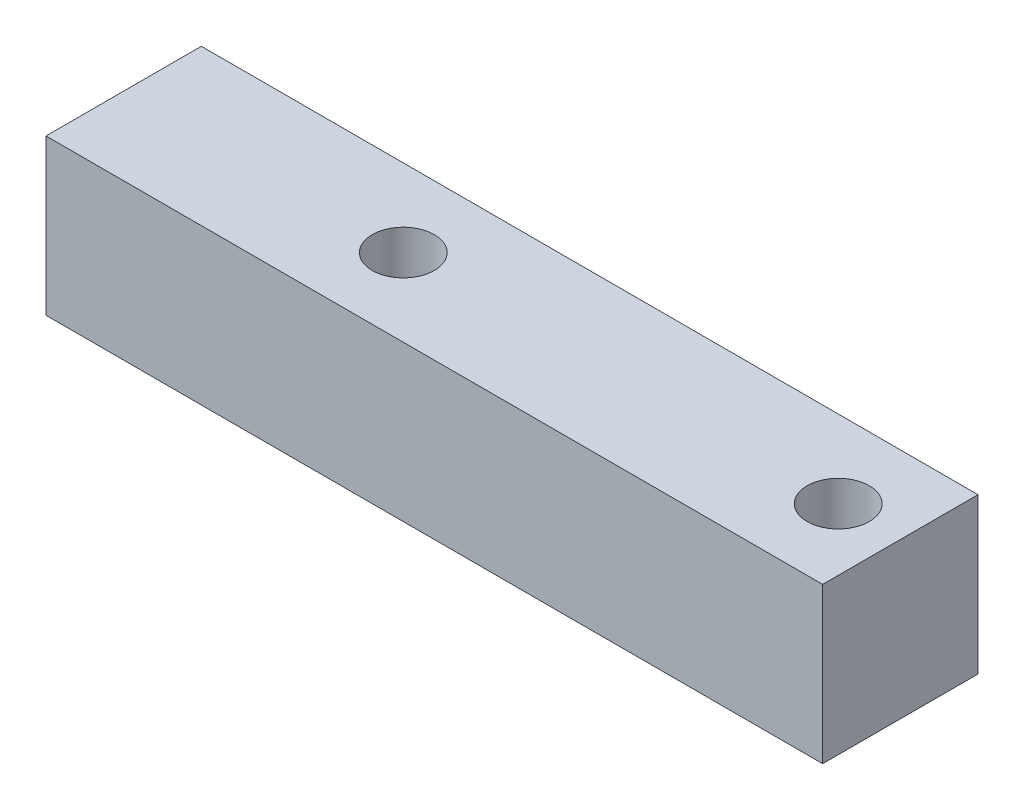
ISO-10303-21;
HEADER;
FILE_DESCRIPTION(('STEP AP214'),'2;1');
FILE_NAME('part.step','',(''),(''),'','','');
FILE_SCHEMA(('AUTOMOTIVE_DESIGN { 1 0 10303 214 1 1 1 1 }'));
ENDSEC;
DATA;
#1=APPLICATION_CONTEXT('core data for automotive mechanical design processes');
#2=APPLICATION_PROTOCOL_DEFINITION('international standard','automotive_design',2000,#1);
#3=PRODUCT_CONTEXT('',#1,'mechanical');
#4=PRODUCT('Part','Part','',(#3));
#5=PRODUCT_RELATED_PRODUCT_CATEGORY('part','',(#4));
#6=PRODUCT_DEFINITION_FORMATION('','',#4);
#7=PRODUCT_DEFINITION_CONTEXT('part definition',#1,'design');
#8=PRODUCT_DEFINITION('design','',#6,#7);
#9=PRODUCT_DEFINITION_SHAPE('','',#8);
#10=(LENGTH_UNIT() NAMED_UNIT(*) SI_UNIT(.MILLI.,.METRE.));
#11=(NAMED_UNIT(*) PLANE_ANGLE_UNIT() SI_UNIT($,.RADIAN.));
#12=(NAMED_UNIT(*) SI_UNIT($,.STERADIAN.) SOLID_ANGLE_UNIT());
#13=UNCERTAINTY_MEASURE_WITH_UNIT(LENGTH_MEASURE(1.E-05),#10,'distance_accuracy_value','');
#14=(GEOMETRIC_REPRESENTATION_CONTEXT(3) GLOBAL_UNCERTAINTY_ASSIGNED_CONTEXT((#13)) GLOBAL_UNIT_ASSIGNED_CONTEXT((#10,
#11,#12)) REPRESENTATION_CONTEXT('',''));
#15=CARTESIAN_POINT('',(0.,0.,0.));
#16=DIRECTION('',(0.,0.,1.));
#17=DIRECTION('',(1.,0.,0.));
#18=AXIS2_PLACEMENT_3D('',#15,#16,#17);
#19=CARTESIAN_POINT('',(-39.6874999999998,-7.93750000000001,7.9375));
#20=DIRECTION('',(1.,0.,0.));
#21=DIRECTION('',(0.,0.,-1.));
#22=AXIS2_PLACEMENT_3D('',#19,#20,#21);
#23=PLANE('',#22);
#24=CARTESIAN_POINT('',(-39.6874999999998,0.,0.));
#25=DIRECTION('',(-1.,0.,0.));
#26=DIRECTION('',(0.,0.,1.));
#27=AXIS2_PLACEMENT_3D('',#24,#25,#26);
#28=CIRCLE('',#27,4.7625);
#29=CARTESIAN_POINT('',(-39.6874999999998,0.,4.7625));
#30=VERTEX_POINT('',#29);
#31=EDGE_CURVE('E111',#30,#30,#28,.T.);
#32=ORIENTED_EDGE('',*,*,#31,.F.);
#33=EDGE_LOOP('',(#32));
#34=FACE_BOUND('',#33,.T.);
#35=DIRECTION('',(0.,-1.,0.));
#36=VECTOR('',#35,1.);
#37=CARTESIAN_POINT('',(-39.6874999999998,-7.93750000000001,-7.9375));
#38=LINE('',#37,#36);
#39=CARTESIAN_POINT('',(-39.6874999999998,7.93749999999999,-7.9375));
#40=VERTEX_POINT('',#39);
#41=CARTESIAN_POINT('',(-39.6874999999998,-7.93750000000001,-7.9375));
#42=VERTEX_POINT('',#41);
#43=EDGE_CURVE('E97',#40,#42,#38,.T.);
#44=ORIENTED_EDGE('',*,*,#43,.T.);
#45=DIRECTION('',(0.,0.,-1.));
#46=VECTOR('',#45,1.);
#47=CARTESIAN_POINT('',(-39.6874999999998,-7.93750000000001,7.9375));
#48=LINE('',#47,#46);
#49=CARTESIAN_POINT('',(-39.6874999999998,-7.93750000000001,7.9375));
#50=VERTEX_POINT('',#49);
#51=EDGE_CURVE('E11',#50,#42,#48,.T.);
#52=ORIENTED_EDGE('',*,*,#51,.F.);
#53=DIRECTION('',(0.,-1.,0.));
#54=VECTOR('',#53,1.);
#55=CARTESIAN_POINT('',(-39.6874999999998,-7.93750000000001,7.9375));
#56=LINE('',#55,#54);
#57=CARTESIAN_POINT('',(-39.6874999999998,7.93749999999999,7.9375));
#58=VERTEX_POINT('',#57);
#59=EDGE_CURVE('E85',#58,#50,#56,.T.);
#60=ORIENTED_EDGE('',*,*,#59,.F.);
#61=DIRECTION('',(0.,0.,-1.));
#62=VECTOR('',#61,1.);
#63=CARTESIAN_POINT('',(-39.6874999999998,7.93749999999999,7.9375));
#64=LINE('',#63,#62);
#65=EDGE_CURVE('E93',#58,#40,#64,.T.);
#66=ORIENTED_EDGE('',*,*,#65,.T.);
#67=EDGE_LOOP('',(#44,#52,#60,#66));
#68=FACE_BOUND('',#67,.T.);
#69=ADVANCED_FACE('F34',(#34,#68),#23,.F.);
#70=CARTESIAN_POINT('',(39.6875000000002,-7.93749999999998,7.9375));
#71=DIRECTION('',(0.,1.,0.));
#72=DIRECTION('',(-1.,0.,0.));
#73=AXIS2_PLACEMENT_3D('',#70,#71,#72);
#74=PLANE('',#73);
#75=CARTESIAN_POINT('',(-11.1124999999998,-7.93750000000003,0.));
#76=DIRECTION('',(0.,1.,0.));
#77=DIRECTION('',(-1.,0.,0.));
#78=AXIS2_PLACEMENT_3D('',#75,#76,#77);
#79=CIRCLE('',#78,3.175);
#80=CARTESIAN_POINT('',(-14.2874999999998,-7.93750000000003,0.));
#81=VERTEX_POINT('',#80);
#82=EDGE_CURVE('E120',#81,#81,#79,.T.);
#83=ORIENTED_EDGE('',*,*,#82,.T.);
#84=EDGE_LOOP('',(#83));
#85=FACE_BOUND('',#84,.T.);
#86=CARTESIAN_POINT('',(33.3375000000002,-7.93750000000002,0.));
#87=DIRECTION('',(0.,1.,0.));
#88=DIRECTION('',(-1.,0.,0.));
#89=AXIS2_PLACEMENT_3D('',#86,#87,#88);
#90=CIRCLE('',#89,3.175);
#91=CARTESIAN_POINT('',(30.1625000000002,-7.93750000000002,0.));
#92=VERTEX_POINT('',#91);
#93=EDGE_CURVE('E114',#92,#92,#90,.T.);
#94=ORIENTED_EDGE('',*,*,#93,.T.);
#95=EDGE_LOOP('',(#94));
#96=FACE_BOUND('',#95,.T.);
#97=DIRECTION('',(1.,0.,0.));
#98=VECTOR('',#97,1.);
#99=CARTESIAN_POINT('',(39.6875000000002,-7.93749999999998,-7.9375));
#100=LINE('',#99,#98);
#101=CARTESIAN_POINT('',(39.6875000000002,-7.93749999999998,-7.9375));
#102=VERTEX_POINT('',#101);
#103=EDGE_CURVE('E89',#42,#102,#100,.T.);
#104=ORIENTED_EDGE('',*,*,#103,.T.);
#105=DIRECTION('',(0.,0.,-1.));
#106=VECTOR('',#105,1.);
#107=CARTESIAN_POINT('',(39.6875000000002,-7.93749999999998,7.9375));
#108=LINE('',#107,#106);
#109=CARTESIAN_POINT('',(39.6875000000002,-7.93749999999998,7.9375));
#110=VERTEX_POINT('',#109);
#111=EDGE_CURVE('E42',#110,#102,#108,.T.);
#112=ORIENTED_EDGE('',*,*,#111,.F.);
#113=DIRECTION('',(1.,0.,0.));
#114=VECTOR('',#113,1.);
#115=CARTESIAN_POINT('',(39.6875000000002,-7.93749999999998,7.9375));
#116=LINE('',#115,#114);
#117=EDGE_CURVE('E80',#50,#110,#116,.T.);
#118=ORIENTED_EDGE('',*,*,#117,.F.);
#119=ORIENTED_EDGE('',*,*,#51,.T.);
#120=EDGE_LOOP('',(#104,#112,#118,#119));
#121=FACE_BOUND('',#120,.T.);
#122=ADVANCED_FACE('F88',(#85,#96,#121),#74,.F.);
#123=CARTESIAN_POINT('',(39.6875000000002,-7.93749999999998,7.9375));
#124=DIRECTION('',(-1.,0.,0.));
#125=DIRECTION('',(0.,0.,1.));
#126=AXIS2_PLACEMENT_3D('',#123,#124,#125);
#127=PLANE('',#126);
#128=DIRECTION('',(0.,1.,0.));
#129=VECTOR('',#128,1.);
#130=CARTESIAN_POINT('',(39.6875000000002,-7.93749999999998,-7.9375));
#131=LINE('',#130,#129);
#132=CARTESIAN_POINT('',(39.6875000000002,7.93750000000002,-7.9375));
#133=VERTEX_POINT('',#132);
#134=EDGE_CURVE('E67',#102,#133,#131,.T.);
#135=ORIENTED_EDGE('',*,*,#134,.T.);
#136=DIRECTION('',(0.,0.,-1.));
#137=VECTOR('',#136,1.);
#138=CARTESIAN_POINT('',(39.6875000000002,7.93750000000002,7.9375));
#139=LINE('',#138,#137);
#140=CARTESIAN_POINT('',(39.6875000000002,7.93750000000002,7.9375));
#141=VERTEX_POINT('',#140);
#142=EDGE_CURVE('E90',#141,#133,#139,.T.);
#143=ORIENTED_EDGE('',*,*,#142,.F.);
#144=DIRECTION('',(0.,1.,0.));
#145=VECTOR('',#144,1.);
#146=CARTESIAN_POINT('',(39.6875000000002,-7.93749999999998,7.9375));
#147=LINE('',#146,#145);
#148=EDGE_CURVE('E83',#110,#141,#147,.T.);
#149=ORIENTED_EDGE('',*,*,#148,.F.);
#150=ORIENTED_EDGE('',*,*,#111,.T.);
#151=EDGE_LOOP('',(#135,#143,#149,#150));
#152=FACE_BOUND('',#151,.T.);
#153=ADVANCED_FACE('F91',(#152),#127,.F.);
#154=CARTESIAN_POINT('',(39.6875000000002,7.93750000000002,7.9375));
#155=DIRECTION('',(0.,-1.,0.));
#156=DIRECTION('',(1.,0.,0.));
#157=AXIS2_PLACEMENT_3D('',#154,#155,#156);
#158=PLANE('',#157);
#159=CARTESIAN_POINT('',(-11.1124999999998,7.9375,0.));
#160=DIRECTION('',(0.,1.,0.));
#161=DIRECTION('',(-1.,0.,0.));
#162=AXIS2_PLACEMENT_3D('',#159,#160,#161);
#163=CIRCLE('',#162,3.175);
#164=CARTESIAN_POINT('',(-14.2874999999998,7.9375,0.));
#165=VERTEX_POINT('',#164);
#166=EDGE_CURVE('E123',#165,#165,#163,.T.);
#167=ORIENTED_EDGE('',*,*,#166,.F.);
#168=EDGE_LOOP('',(#167));
#169=FACE_BOUND('',#168,.T.);
#170=CARTESIAN_POINT('',(33.3375000000002,7.93750000000001,0.));
#171=DIRECTION('',(0.,1.,0.));
#172=DIRECTION('',(-1.,0.,0.));
#173=AXIS2_PLACEMENT_3D('',#170,#171,#172);
#174=CIRCLE('',#173,3.175);
#175=CARTESIAN_POINT('',(30.1625000000002,7.93750000000001,0.));
#176=VERTEX_POINT('',#175);
#177=EDGE_CURVE('E117',#176,#176,#174,.T.);
#178=ORIENTED_EDGE('',*,*,#177,.F.);
#179=EDGE_LOOP('',(#178));
#180=FACE_BOUND('',#179,.T.);
#181=DIRECTION('',(-1.,0.,0.));
#182=VECTOR('',#181,1.);
#183=CARTESIAN_POINT('',(39.6875000000002,7.93750000000002,-7.9375));
#184=LINE('',#183,#182);
#185=EDGE_CURVE('E73',#133,#40,#184,.T.);
#186=ORIENTED_EDGE('',*,*,#185,.T.);
#187=ORIENTED_EDGE('',*,*,#65,.F.);
#188=DIRECTION('',(-1.,0.,0.));
#189=VECTOR('',#188,1.);
#190=CARTESIAN_POINT('',(39.6875000000002,7.93750000000002,7.9375));
#191=LINE('',#190,#189);
#192=EDGE_CURVE('E50',#141,#58,#191,.T.);
#193=ORIENTED_EDGE('',*,*,#192,.F.);
#194=ORIENTED_EDGE('',*,*,#142,.T.);
#195=EDGE_LOOP('',(#186,#187,#193,#194));
#196=FACE_BOUND('',#195,.T.);
#197=ADVANCED_FACE('F105',(#169,#180,#196),#158,.F.);
#198=CARTESIAN_POINT('',(0.,0.,7.9375));
#199=DIRECTION('',(0.,0.,1.));
#200=DIRECTION('',(1.,0.,0.));
#201=AXIS2_PLACEMENT_3D('',#198,#199,#200);
#202=PLANE('',#201);
#203=ORIENTED_EDGE('',*,*,#59,.T.);
#204=ORIENTED_EDGE('',*,*,#117,.T.);
#205=ORIENTED_EDGE('',*,*,#148,.T.);
#206=ORIENTED_EDGE('',*,*,#192,.T.);
#207=EDGE_LOOP('',(#203,#204,#205,#206));
#208=FACE_BOUND('',#207,.T.);
#209=ADVANCED_FACE('F81',(#208),#202,.T.);
#210=CARTESIAN_POINT('',(0.,0.,-7.9375));
#211=DIRECTION('',(0.,0.,1.));
#212=DIRECTION('',(1.,0.,0.));
#213=AXIS2_PLACEMENT_3D('',#210,#211,#212);
#214=PLANE('',#213);
#215=ORIENTED_EDGE('',*,*,#43,.F.);
#216=ORIENTED_EDGE('',*,*,#185,.F.);
#217=ORIENTED_EDGE('',*,*,#134,.F.);
#218=ORIENTED_EDGE('',*,*,#103,.F.);
#219=EDGE_LOOP('',(#215,#216,#217,#218));
#220=FACE_BOUND('',#219,.T.);
#221=ADVANCED_FACE('F108',(#220),#214,.F.);
#222=CARTESIAN_POINT('',(-20.6374999999998,0.,0.));
#223=DIRECTION('',(-1.,0.,0.));
#224=DIRECTION('',(0.,0.,1.));
#225=AXIS2_PLACEMENT_3D('',#222,#223,#224);
#226=CYLINDRICAL_SURFACE('',#225,4.7625);
#227=CARTESIAN_POINT('',(-20.6374999999998,0.,0.));
#228=DIRECTION('',(-1.,0.,0.));
#229=DIRECTION('',(0.,0.,1.));
#230=AXIS2_PLACEMENT_3D('',#227,#228,#229);
#231=CIRCLE('',#230,4.7625);
#232=CARTESIAN_POINT('',(-20.6374999999998,0.,4.7625));
#233=VERTEX_POINT('',#232);
#234=EDGE_CURVE('E100',#233,#233,#231,.T.);
#235=CARTESIAN_POINT('',(-20.6374999999998,0.,4.7625));
#236=CARTESIAN_POINT('',(-20.8359374999998,0.,4.7625));
#237=CARTESIAN_POINT('',(-21.0343749999998,0.,4.7625));
#238=CARTESIAN_POINT('',(-21.4312499999998,0.,4.7625));
#239=CARTESIAN_POINT('',(-21.6296874999998,0.,4.7625));
#240=CARTESIAN_POINT('',(-22.0265624999998,0.,4.7625));
#241=CARTESIAN_POINT('',(-22.2249999999998,0.,4.7625));
#242=CARTESIAN_POINT('',(-22.6218749999998,0.,4.7625));
#243=CARTESIAN_POINT('',(-22.8203124999998,0.,4.7625));
#244=CARTESIAN_POINT('',(-23.2171874999998,0.,4.7625));
#245=CARTESIAN_POINT('',(-23.4156249999998,0.,4.7625));
#246=CARTESIAN_POINT('',(-23.8124999999998,0.,4.7625));
#247=CARTESIAN_POINT('',(-24.0109374999998,0.,4.7625));
#248=CARTESIAN_POINT('',(-24.4078124999998,0.,4.7625));
#249=CARTESIAN_POINT('',(-24.6062499999998,0.,4.7625));
#250=CARTESIAN_POINT('',(-25.0031249999998,0.,4.7625));
#251=CARTESIAN_POINT('',(-25.2015624999998,0.,4.7625));
#252=CARTESIAN_POINT('',(-25.5984374999998,0.,4.7625));
#253=CARTESIAN_POINT('',(-25.7968749999998,0.,4.7625));
#254=CARTESIAN_POINT('',(-26.1937499999998,0.,4.7625));
#255=CARTESIAN_POINT('',(-26.3921874999998,0.,4.7625));
#256=CARTESIAN_POINT('',(-26.7890624999998,0.,4.7625));
#257=CARTESIAN_POINT('',(-26.9874999999998,0.,4.7625));
#258=CARTESIAN_POINT('',(-27.3843749999998,0.,4.7625));
#259=CARTESIAN_POINT('',(-27.5828124999998,0.,4.7625));
#260=CARTESIAN_POINT('',(-27.9796874999998,0.,4.7625));
#261=CARTESIAN_POINT('',(-28.1781249999998,0.,4.7625));
#262=CARTESIAN_POINT('',(-28.5749999999998,0.,4.7625));
#263=CARTESIAN_POINT('',(-28.7734374999998,0.,4.7625));
#264=CARTESIAN_POINT('',(-29.1703124999998,0.,4.7625));
#265=CARTESIAN_POINT('',(-29.3687499999998,0.,4.7625));
#266=CARTESIAN_POINT('',(-29.7656249999998,0.,4.7625));
#267=CARTESIAN_POINT('',(-29.9640624999998,0.,4.7625));
#268=CARTESIAN_POINT('',(-30.3609374999998,0.,4.7625));
#269=CARTESIAN_POINT('',(-30.5593749999998,0.,4.7625));
#270=CARTESIAN_POINT('',(-30.9562499999998,0.,4.7625));
#271=CARTESIAN_POINT('',(-31.1546874999998,0.,4.7625));
#272=CARTESIAN_POINT('',(-31.5515624999998,0.,4.7625));
#273=CARTESIAN_POINT('',(-31.7499999999998,0.,4.7625));
#274=CARTESIAN_POINT('',(-32.1468749999998,0.,4.7625));
#275=CARTESIAN_POINT('',(-32.3453124999998,0.,4.7625));
#276=CARTESIAN_POINT('',(-32.7421874999998,0.,4.7625));
#277=CARTESIAN_POINT('',(-32.9406249999998,0.,4.7625));
#278=CARTESIAN_POINT('',(-33.3374999999998,0.,4.7625));
#279=CARTESIAN_POINT('',(-33.5359374999998,0.,4.7625));
#280=CARTESIAN_POINT('',(-33.9328124999998,0.,4.7625));
#281=CARTESIAN_POINT('',(-34.1312499999998,0.,4.7625));
#282=CARTESIAN_POINT('',(-34.5281249999998,0.,4.7625));
#283=CARTESIAN_POINT('',(-34.7265624999998,0.,4.7625));
#284=CARTESIAN_POINT('',(-35.1234374999998,0.,4.7625));
#285=CARTESIAN_POINT('',(-35.3218749999998,0.,4.7625));
#286=CARTESIAN_POINT('',(-35.7187499999998,0.,4.7625));
#287=CARTESIAN_POINT('',(-35.9171874999998,0.,4.7625));
#288=CARTESIAN_POINT('',(-36.3140624999998,0.,4.7625));
#289=CARTESIAN_POINT('',(-36.5124999999998,0.,4.7625));
#290=CARTESIAN_POINT('',(-36.9093749999998,0.,4.7625));
#291=CARTESIAN_POINT('',(-37.1078124999998,0.,4.7625));
#292=CARTESIAN_POINT('',(-37.5046874999998,0.,4.7625));
#293=CARTESIAN_POINT('',(-37.7031249999998,0.,4.7625));
#294=CARTESIAN_POINT('',(-38.0999999999998,0.,4.7625));
#295=CARTESIAN_POINT('',(-38.2984374999998,0.,4.7625));
#296=CARTESIAN_POINT('',(-38.6953124999998,0.,4.7625));
#297=CARTESIAN_POINT('',(-38.8937499999998,0.,4.7625));
#298=CARTESIAN_POINT('',(-39.2906249999998,0.,4.7625));
#299=CARTESIAN_POINT('',(-39.4890624999998,0.,4.7625));
#300=CARTESIAN_POINT('',(-39.6874999999998,0.,4.7625));
#301=B_SPLINE_CURVE_WITH_KNOTS('',3,(#235,#236,#237,#238,#239,#240,#241,#242,#243,#244,#245,
#246,#247,#248,#249,#250,#251,#252,#253,#254,#255,#256,#257,#258,#259,#260,#261,#262,#263,#264,
#265,#266,#267,#268,#269,#270,#271,#272,#273,#274,#275,#276,#277,#278,#279,#280,#281,#282,#283,
#284,#285,#286,#287,#288,#289,#290,#291,#292,#293,#294,#295,#296,#297,#298,#299,#300),
.UNSPECIFIED.,.F.,.F.,(4,2,2,2,2,2,2,2,2,2,2,2,2,2,2,2,2,2,2,2,2,2,2,2,2,2,2,2,2,2,2,2,4),(0.,
0.595312499999997,1.190625,1.7859375,2.38125,2.9765625,3.571875,4.1671875,4.7625,5.3578125,
5.953125,6.5484375,7.14375,7.7390625,8.334375,8.9296875,9.525,10.1203125,10.715625,11.3109375,
11.90625,12.5015625,13.096875,13.6921875,14.2875,14.8828125,15.478125,16.0734375,16.66875,
17.2640625,17.859375,18.4546875,19.05),.UNSPECIFIED.);
#302=EDGE_CURVE('BSEAM150',#233,#30,#301,.T.);
#303=ORIENTED_EDGE('',*,*,#234,.F.);
#304=ORIENTED_EDGE('',*,*,#31,.T.);
#305=ORIENTED_EDGE('',*,*,#302,.T.);
#306=ORIENTED_EDGE('',*,*,#302,.F.);
#307=EDGE_LOOP('',(#303,#305,#304,#306));
#308=FACE_BOUND('',#307,.T.);
#309=ADVANCED_FACE('F150',(#308),#226,.F.);
#310=CARTESIAN_POINT('',(-20.6374999999998,0.,0.));
#311=DIRECTION('',(-1.,0.,0.));
#312=DIRECTION('',(0.,0.,1.));
#313=AXIS2_PLACEMENT_3D('',#310,#311,#312);
#314=PLANE('',#313);
#315=ORIENTED_EDGE('',*,*,#234,.T.);
#316=EDGE_LOOP('',(#315));
#317=FACE_BOUND('',#316,.T.);
#318=ADVANCED_FACE('F144',(#317),#314,.T.);
#319=CARTESIAN_POINT('',(33.3375000000002,-7.93750000000002,0.));
#320=DIRECTION('',(0.,1.,0.));
#321=DIRECTION('',(-1.,0.,0.));
#322=AXIS2_PLACEMENT_3D('',#319,#320,#321);
#323=CYLINDRICAL_SURFACE('',#322,3.175);
#324=ORIENTED_EDGE('',*,*,#93,.F.);
#325=EDGE_LOOP('',(#324));
#326=FACE_BOUND('',#325,.T.);
#327=ORIENTED_EDGE('',*,*,#177,.T.);
#328=EDGE_LOOP('',(#327));
#329=FACE_BOUND('',#328,.T.);
#330=ADVANCED_FACE('F134',(#326,#329),#323,.F.);
#331=CARTESIAN_POINT('',(-11.1124999999998,-7.93750000000003,0.));
#332=DIRECTION('',(0.,1.,0.));
#333=DIRECTION('',(-1.,0.,0.));
#334=AXIS2_PLACEMENT_3D('',#331,#332,#333);
#335=CYLINDRICAL_SURFACE('',#334,3.175);
#336=ORIENTED_EDGE('',*,*,#82,.F.);
#337=EDGE_LOOP('',(#336));
#338=FACE_BOUND('',#337,.T.);
#339=ORIENTED_EDGE('',*,*,#166,.T.);
#340=EDGE_LOOP('',(#339));
#341=FACE_BOUND('',#340,.T.);
#342=ADVANCED_FACE('F131',(#338,#341),#335,.F.);
#343=CLOSED_SHELL('',(#69,#122,#153,#197,#209,#221,#309,#318,#330,#342));
#344=MANIFOLD_SOLID_BREP('B2',#343);
#345=ADVANCED_BREP_SHAPE_REPRESENTATION('',(#18,#344),#14);
#346=SHAPE_DEFINITION_REPRESENTATION(#9,#345);
ENDSEC;
END-ISO-10303-21;
